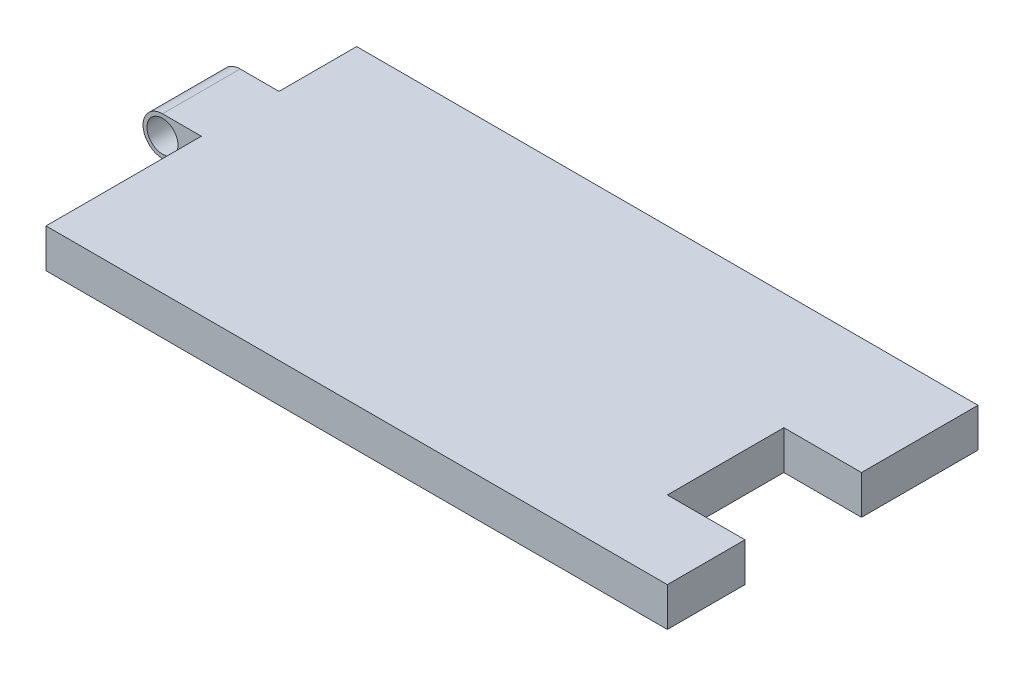
ISO-10303-21;
HEADER;
FILE_DESCRIPTION(('STEP AP214'),'2;1');
FILE_NAME('part.step','',(''),(''),'','','');
FILE_SCHEMA(('AUTOMOTIVE_DESIGN { 1 0 10303 214 1 1 1 1 }'));
ENDSEC;
DATA;
#1=APPLICATION_CONTEXT('core data for automotive mechanical design processes');
#2=APPLICATION_PROTOCOL_DEFINITION('international standard','automotive_design',2000,#1);
#3=PRODUCT_CONTEXT('',#1,'mechanical');
#4=PRODUCT('Part','Part','',(#3));
#5=PRODUCT_RELATED_PRODUCT_CATEGORY('part','',(#4));
#6=PRODUCT_DEFINITION_FORMATION('','',#4);
#7=PRODUCT_DEFINITION_CONTEXT('part definition',#1,'design');
#8=PRODUCT_DEFINITION('design','',#6,#7);
#9=PRODUCT_DEFINITION_SHAPE('','',#8);
#10=(LENGTH_UNIT() NAMED_UNIT(*) SI_UNIT(.MILLI.,.METRE.));
#11=(NAMED_UNIT(*) PLANE_ANGLE_UNIT() SI_UNIT($,.RADIAN.));
#12=(NAMED_UNIT(*) SI_UNIT($,.STERADIAN.) SOLID_ANGLE_UNIT());
#13=UNCERTAINTY_MEASURE_WITH_UNIT(LENGTH_MEASURE(1.E-05),#10,'distance_accuracy_value','');
#14=(GEOMETRIC_REPRESENTATION_CONTEXT(3) GLOBAL_UNCERTAINTY_ASSIGNED_CONTEXT((#13)) GLOBAL_UNIT_ASSIGNED_CONTEXT((#10,
#11,#12)) REPRESENTATION_CONTEXT('',''));
#15=CARTESIAN_POINT('',(0.,0.,0.));
#16=DIRECTION('',(0.,0.,1.));
#17=DIRECTION('',(1.,0.,0.));
#18=AXIS2_PLACEMENT_3D('',#15,#16,#17);
#19=CARTESIAN_POINT('',(0.,-2.5,-5.));
#20=DIRECTION('',(0.,-1.,0.));
#21=DIRECTION('',(0.,0.,-1.));
#22=AXIS2_PLACEMENT_3D('',#19,#20,#21);
#23=PLANE('',#22);
#24=DIRECTION('',(0.,0.,1.));
#25=VECTOR('',#24,1.);
#26=CARTESIAN_POINT('',(-5.,-2.49999999999998,0.));
#27=LINE('',#26,#25);
#28=CARTESIAN_POINT('',(-5.,-2.49999999999998,0.));
#29=VERTEX_POINT('',#28);
#30=CARTESIAN_POINT('',(-5.,-2.49999999999998,15.));
#31=VERTEX_POINT('',#30);
#32=EDGE_CURVE('E183',#29,#31,#27,.T.);
#33=ORIENTED_EDGE('',*,*,#32,.T.);
#34=DIRECTION('',(1.,0.,0.));
#35=VECTOR('',#34,1.);
#36=CARTESIAN_POINT('',(-75.,-2.5,15.));
#37=LINE('',#36,#35);
#38=CARTESIAN_POINT('',(5.,-2.5,15.));
#39=VERTEX_POINT('',#38);
#40=EDGE_CURVE('E165',#31,#39,#37,.T.);
#41=ORIENTED_EDGE('',*,*,#40,.T.);
#42=DIRECTION('',(0.,0.,-1.));
#43=VECTOR('',#42,1.);
#44=CARTESIAN_POINT('',(5.,-2.5,25.));
#45=LINE('',#44,#43);
#46=CARTESIAN_POINT('',(5.,-2.5,25.));
#47=VERTEX_POINT('',#46);
#48=EDGE_CURVE('E140',#47,#39,#45,.T.);
#49=ORIENTED_EDGE('',*,*,#48,.F.);
#50=DIRECTION('',(1.,0.,0.));
#51=VECTOR('',#50,1.);
#52=CARTESIAN_POINT('',(-75.,-2.5,25.));
#53=LINE('',#52,#51);
#54=CARTESIAN_POINT('',(-75.,-2.5,25.));
#55=VERTEX_POINT('',#54);
#56=EDGE_CURVE('E136',#55,#47,#53,.T.);
#57=ORIENTED_EDGE('',*,*,#56,.F.);
#58=DIRECTION('',(0.,0.,-1.));
#59=VECTOR('',#58,1.);
#60=CARTESIAN_POINT('',(-75.,-2.5,15.));
#61=LINE('',#60,#59);
#62=CARTESIAN_POINT('',(-75.,-2.5,5.));
#63=VERTEX_POINT('',#62);
#64=EDGE_CURVE('E125',#55,#63,#61,.T.);
#65=ORIENTED_EDGE('',*,*,#64,.T.);
#66=DIRECTION('',(1.,0.,0.));
#67=VECTOR('',#66,1.);
#68=CARTESIAN_POINT('',(0.,-2.5,5.));
#69=LINE('',#68,#67);
#70=CARTESIAN_POINT('',(-80.,-2.5,5.));
#71=VERTEX_POINT('',#70);
#72=EDGE_CURVE('E230',#71,#63,#69,.T.);
#73=ORIENTED_EDGE('',*,*,#72,.F.);
#74=DIRECTION('',(0.,0.,1.));
#75=VECTOR('',#74,1.);
#76=CARTESIAN_POINT('',(-80.,-2.5,-5.));
#77=LINE('',#76,#75);
#78=CARTESIAN_POINT('',(-80.,-2.5,-5.));
#79=VERTEX_POINT('',#78);
#80=EDGE_CURVE('E42',#79,#71,#77,.T.);
#81=ORIENTED_EDGE('',*,*,#80,.F.);
#82=DIRECTION('',(1.,0.,0.));
#83=VECTOR('',#82,1.);
#84=CARTESIAN_POINT('',(0.,-2.5,-5.));
#85=LINE('',#84,#83);
#86=CARTESIAN_POINT('',(-75.,-2.5,-5.));
#87=VERTEX_POINT('',#86);
#88=EDGE_CURVE('E222',#79,#87,#85,.T.);
#89=ORIENTED_EDGE('',*,*,#88,.T.);
#90=DIRECTION('',(0.,0.,1.));
#91=VECTOR('',#90,1.);
#92=CARTESIAN_POINT('',(-75.,-2.49999999999999,-15.));
#93=LINE('',#92,#91);
#94=CARTESIAN_POINT('',(-75.,-2.49999999999999,-15.));
#95=VERTEX_POINT('',#94);
#96=EDGE_CURVE('E248',#95,#87,#93,.T.);
#97=ORIENTED_EDGE('',*,*,#96,.F.);
#98=DIRECTION('',(-1.,0.,0.));
#99=VECTOR('',#98,1.);
#100=CARTESIAN_POINT('',(0.,-2.5,-15.));
#101=LINE('',#100,#99);
#102=CARTESIAN_POINT('',(5.,-2.49999999999998,-15.));
#103=VERTEX_POINT('',#102);
#104=EDGE_CURVE('E280',#103,#95,#101,.T.);
#105=ORIENTED_EDGE('',*,*,#104,.F.);
#106=DIRECTION('',(0.,0.,-1.));
#107=VECTOR('',#106,1.);
#108=CARTESIAN_POINT('',(5.,-2.49999999999998,-15.));
#109=LINE('',#108,#107);
#110=CARTESIAN_POINT('',(5.,-2.49999999999998,0.));
#111=VERTEX_POINT('',#110);
#112=EDGE_CURVE('E267',#111,#103,#109,.T.);
#113=ORIENTED_EDGE('',*,*,#112,.F.);
#114=DIRECTION('',(1.,0.,0.));
#115=VECTOR('',#114,1.);
#116=CARTESIAN_POINT('',(5.,-2.49999999999998,0.));
#117=LINE('',#116,#115);
#118=EDGE_CURVE('E266',#29,#111,#117,.T.);
#119=ORIENTED_EDGE('',*,*,#118,.F.);
#120=EDGE_LOOP('',(#33,#41,#49,#57,#65,#73,#81,#89,#97,#105,#113,#119));
#121=FACE_BOUND('',#120,.T.);
#122=CARTESIAN_POINT('',(-10.,-2.5,-10.));
#123=DIRECTION('',(0.,-1.,0.));
#124=DIRECTION('',(0.,0.,-1.));
#125=AXIS2_PLACEMENT_3D('',#122,#123,#124);
#126=CIRCLE('',#125,2.);
#127=CARTESIAN_POINT('',(-10.,-2.5,-12.));
#128=VERTEX_POINT('',#127);
#129=EDGE_CURVE('E155',#128,#128,#126,.T.);
#130=ORIENTED_EDGE('',*,*,#129,.F.);
#131=EDGE_LOOP('',(#130));
#132=FACE_BOUND('',#131,.T.);
#133=ADVANCED_FACE('F33',(#121,#132),#23,.T.);
#134=CARTESIAN_POINT('',(-80.,0.,-5.));
#135=DIRECTION('',(0.,0.,1.));
#136=DIRECTION('',(1.,0.,0.));
#137=AXIS2_PLACEMENT_3D('',#134,#135,#136);
#138=PLANE('',#137);
#139=CARTESIAN_POINT('',(-80.,0.,-5.));
#140=DIRECTION('',(0.,0.,1.));
#141=DIRECTION('',(1.,0.,0.));
#142=AXIS2_PLACEMENT_3D('',#139,#140,#141);
#143=CIRCLE('',#142,2.);
#144=CARTESIAN_POINT('',(-78.,0.,-5.));
#145=VERTEX_POINT('',#144);
#146=EDGE_CURVE('E239',#145,#145,#143,.T.);
#147=ORIENTED_EDGE('',*,*,#146,.T.);
#148=EDGE_LOOP('',(#147));
#149=FACE_BOUND('',#148,.T.);
#150=DIRECTION('',(0.,1.,0.));
#151=VECTOR('',#150,1.);
#152=CARTESIAN_POINT('',(-75.,-2.49999999999999,-5.));
#153=LINE('',#152,#151);
#154=CARTESIAN_POINT('',(-75.,2.50000000000002,-5.));
#155=VERTEX_POINT('',#154);
#156=EDGE_CURVE('E50',#87,#155,#153,.T.);
#157=ORIENTED_EDGE('',*,*,#156,.F.);
#158=ORIENTED_EDGE('',*,*,#88,.F.);
#159=CARTESIAN_POINT('',(-80.,0.,-5.));
#160=DIRECTION('',(0.,0.,1.));
#161=DIRECTION('',(1.,0.,0.));
#162=AXIS2_PLACEMENT_3D('',#159,#160,#161);
#163=CIRCLE('',#162,2.50000000000001);
#164=CARTESIAN_POINT('',(-80.,2.50000000000002,-5.));
#165=VERTEX_POINT('',#164);
#166=EDGE_CURVE('E241',#165,#79,#163,.T.);
#167=ORIENTED_EDGE('',*,*,#166,.F.);
#168=DIRECTION('',(-1.,0.,0.));
#169=VECTOR('',#168,1.);
#170=CARTESIAN_POINT('',(-80.,2.50000000000002,-5.));
#171=LINE('',#170,#169);
#172=EDGE_CURVE('E219',#155,#165,#171,.T.);
#173=ORIENTED_EDGE('',*,*,#172,.F.);
#174=EDGE_LOOP('',(#157,#158,#167,#173));
#175=FACE_BOUND('',#174,.T.);
#176=ADVANCED_FACE('F291',(#149,#175),#138,.F.);
#177=CARTESIAN_POINT('',(-80.,0.,-5.));
#178=DIRECTION('',(0.,0.,1.));
#179=DIRECTION('',(1.,0.,0.));
#180=AXIS2_PLACEMENT_3D('',#177,#178,#179);
#181=CYLINDRICAL_SURFACE('',#180,2.50000000000001);
#182=ORIENTED_EDGE('',*,*,#80,.T.);
#183=CARTESIAN_POINT('',(-80.,0.,5.));
#184=DIRECTION('',(0.,0.,1.));
#185=DIRECTION('',(1.,0.,0.));
#186=AXIS2_PLACEMENT_3D('',#183,#184,#185);
#187=CIRCLE('',#186,2.50000000000001);
#188=CARTESIAN_POINT('',(-80.,2.50000000000002,5.));
#189=VERTEX_POINT('',#188);
#190=EDGE_CURVE('E212',#189,#71,#187,.T.);
#191=ORIENTED_EDGE('',*,*,#190,.F.);
#192=DIRECTION('',(0.,0.,1.));
#193=VECTOR('',#192,1.);
#194=CARTESIAN_POINT('',(-80.,2.50000000000002,-5.));
#195=LINE('',#194,#193);
#196=EDGE_CURVE('E11',#165,#189,#195,.T.);
#197=ORIENTED_EDGE('',*,*,#196,.F.);
#198=ORIENTED_EDGE('',*,*,#166,.T.);
#199=EDGE_LOOP('',(#182,#191,#197,#198));
#200=FACE_BOUND('',#199,.T.);
#201=ADVANCED_FACE('F35',(#200),#181,.T.);
#202=CARTESIAN_POINT('',(-80.,2.50000000000002,-5.));
#203=DIRECTION('',(0.,1.,0.));
#204=DIRECTION('',(0.,0.,1.));
#205=AXIS2_PLACEMENT_3D('',#202,#203,#204);
#206=PLANE('',#205);
#207=DIRECTION('',(0.,0.,1.));
#208=VECTOR('',#207,1.);
#209=CARTESIAN_POINT('',(-5.,2.50000000000002,0.));
#210=LINE('',#209,#208);
#211=CARTESIAN_POINT('',(-5.,2.50000000000002,0.));
#212=VERTEX_POINT('',#211);
#213=CARTESIAN_POINT('',(-5.,2.50000000000002,15.));
#214=VERTEX_POINT('',#213);
#215=EDGE_CURVE('E181',#212,#214,#210,.T.);
#216=ORIENTED_EDGE('',*,*,#215,.F.);
#217=DIRECTION('',(1.,0.,0.));
#218=VECTOR('',#217,1.);
#219=CARTESIAN_POINT('',(5.,2.50000000000002,0.));
#220=LINE('',#219,#218);
#221=CARTESIAN_POINT('',(5.,2.50000000000002,0.));
#222=VERTEX_POINT('',#221);
#223=EDGE_CURVE('E178',#212,#222,#220,.T.);
#224=ORIENTED_EDGE('',*,*,#223,.T.);
#225=DIRECTION('',(0.,0.,-1.));
#226=VECTOR('',#225,1.);
#227=CARTESIAN_POINT('',(5.,2.50000000000002,-15.));
#228=LINE('',#227,#226);
#229=CARTESIAN_POINT('',(5.,2.50000000000002,-15.));
#230=VERTEX_POINT('',#229);
#231=EDGE_CURVE('E264',#222,#230,#228,.T.);
#232=ORIENTED_EDGE('',*,*,#231,.T.);
#233=DIRECTION('',(1.,0.,0.));
#234=VECTOR('',#233,1.);
#235=CARTESIAN_POINT('',(-75.,2.50000000000002,-15.));
#236=LINE('',#235,#234);
#237=CARTESIAN_POINT('',(-75.,2.50000000000002,-15.));
#238=VERTEX_POINT('',#237);
#239=EDGE_CURVE('E278',#238,#230,#236,.T.);
#240=ORIENTED_EDGE('',*,*,#239,.F.);
#241=DIRECTION('',(0.,0.,1.));
#242=VECTOR('',#241,1.);
#243=CARTESIAN_POINT('',(-75.,2.50000000000002,-15.));
#244=LINE('',#243,#242);
#245=EDGE_CURVE('E255',#238,#155,#244,.T.);
#246=ORIENTED_EDGE('',*,*,#245,.T.);
#247=ORIENTED_EDGE('',*,*,#172,.T.);
#248=ORIENTED_EDGE('',*,*,#196,.T.);
#249=DIRECTION('',(-1.,0.,0.));
#250=VECTOR('',#249,1.);
#251=CARTESIAN_POINT('',(-80.,2.50000000000002,5.));
#252=LINE('',#251,#250);
#253=CARTESIAN_POINT('',(-75.,2.50000000000002,5.));
#254=VERTEX_POINT('',#253);
#255=EDGE_CURVE('E208',#254,#189,#252,.T.);
#256=ORIENTED_EDGE('',*,*,#255,.F.);
#257=DIRECTION('',(0.,0.,-1.));
#258=VECTOR('',#257,1.);
#259=CARTESIAN_POINT('',(-75.,2.50000000000002,15.));
#260=LINE('',#259,#258);
#261=CARTESIAN_POINT('',(-75.,2.50000000000002,25.));
#262=VERTEX_POINT('',#261);
#263=EDGE_CURVE('E133',#262,#254,#260,.T.);
#264=ORIENTED_EDGE('',*,*,#263,.F.);
#265=DIRECTION('',(-1.,0.,0.));
#266=VECTOR('',#265,1.);
#267=CARTESIAN_POINT('',(-75.,2.50000000000002,25.));
#268=LINE('',#267,#266);
#269=CARTESIAN_POINT('',(5.,2.50000000000002,25.));
#270=VERTEX_POINT('',#269);
#271=EDGE_CURVE('E148',#270,#262,#268,.T.);
#272=ORIENTED_EDGE('',*,*,#271,.F.);
#273=DIRECTION('',(0.,0.,-1.));
#274=VECTOR('',#273,1.);
#275=CARTESIAN_POINT('',(5.,2.50000000000002,25.));
#276=LINE('',#275,#274);
#277=CARTESIAN_POINT('',(5.,2.50000000000002,15.));
#278=VERTEX_POINT('',#277);
#279=EDGE_CURVE('E160',#270,#278,#276,.T.);
#280=ORIENTED_EDGE('',*,*,#279,.T.);
#281=DIRECTION('',(-1.,0.,0.));
#282=VECTOR('',#281,1.);
#283=CARTESIAN_POINT('',(-75.,2.50000000000002,15.));
#284=LINE('',#283,#282);
#285=EDGE_CURVE('E149',#278,#214,#284,.T.);
#286=ORIENTED_EDGE('',*,*,#285,.T.);
#287=EDGE_LOOP('',(#216,#224,#232,#240,#246,#247,#248,#256,#264,#272,#280,#286));
#288=FACE_BOUND('',#287,.T.);
#289=ADVANCED_FACE('F196',(#288),#206,.T.);
#290=CARTESIAN_POINT('',(-80.,0.,-5.));
#291=DIRECTION('',(0.,0.,1.));
#292=DIRECTION('',(1.,0.,0.));
#293=AXIS2_PLACEMENT_3D('',#290,#291,#292);
#294=CYLINDRICAL_SURFACE('',#293,2.);
#295=ORIENTED_EDGE('',*,*,#146,.F.);
#296=EDGE_LOOP('',(#295));
#297=FACE_BOUND('',#296,.T.);
#298=CARTESIAN_POINT('',(-80.,0.,5.));
#299=DIRECTION('',(0.,0.,1.));
#300=DIRECTION('',(1.,0.,0.));
#301=AXIS2_PLACEMENT_3D('',#298,#299,#300);
#302=CIRCLE('',#301,2.);
#303=CARTESIAN_POINT('',(-78.,0.,5.));
#304=VERTEX_POINT('',#303);
#305=EDGE_CURVE('E209',#304,#304,#302,.T.);
#306=ORIENTED_EDGE('',*,*,#305,.T.);
#307=EDGE_LOOP('',(#306));
#308=FACE_BOUND('',#307,.T.);
#309=ADVANCED_FACE('F301',(#297,#308),#294,.F.);
#310=CARTESIAN_POINT('',(-80.,0.,5.));
#311=DIRECTION('',(0.,0.,1.));
#312=DIRECTION('',(1.,0.,0.));
#313=AXIS2_PLACEMENT_3D('',#310,#311,#312);
#314=PLANE('',#313);
#315=DIRECTION('',(0.,-1.,0.));
#316=VECTOR('',#315,1.);
#317=CARTESIAN_POINT('',(-75.,2.50000000000002,5.));
#318=LINE('',#317,#316);
#319=EDGE_CURVE('E58',#254,#63,#318,.T.);
#320=ORIENTED_EDGE('',*,*,#319,.F.);
#321=ORIENTED_EDGE('',*,*,#255,.T.);
#322=ORIENTED_EDGE('',*,*,#190,.T.);
#323=ORIENTED_EDGE('',*,*,#72,.T.);
#324=EDGE_LOOP('',(#320,#321,#322,#323));
#325=FACE_BOUND('',#324,.T.);
#326=ORIENTED_EDGE('',*,*,#305,.F.);
#327=EDGE_LOOP('',(#326));
#328=FACE_BOUND('',#327,.T.);
#329=ADVANCED_FACE('F307',(#325,#328),#314,.T.);
#330=CARTESIAN_POINT('',(-75.,2.50000000000002,15.));
#331=DIRECTION('',(1.,0.,0.));
#332=DIRECTION('',(0.,0.,-1.));
#333=AXIS2_PLACEMENT_3D('',#330,#331,#332);
#334=PLANE('',#333);
#335=ORIENTED_EDGE('',*,*,#319,.T.);
#336=ORIENTED_EDGE('',*,*,#64,.F.);
#337=DIRECTION('',(0.,-1.,0.));
#338=VECTOR('',#337,1.);
#339=CARTESIAN_POINT('',(-75.,-2.5,25.));
#340=LINE('',#339,#338);
#341=EDGE_CURVE('E130',#262,#55,#340,.T.);
#342=ORIENTED_EDGE('',*,*,#341,.F.);
#343=ORIENTED_EDGE('',*,*,#263,.T.);
#344=EDGE_LOOP('',(#335,#336,#342,#343));
#345=FACE_BOUND('',#344,.T.);
#346=ADVANCED_FACE('F127',(#345),#334,.F.);
#347=CARTESIAN_POINT('',(-75.,-2.49999999999999,-15.));
#348=DIRECTION('',(1.,0.,0.));
#349=DIRECTION('',(0.,0.,-1.));
#350=AXIS2_PLACEMENT_3D('',#347,#348,#349);
#351=PLANE('',#350);
#352=ORIENTED_EDGE('',*,*,#156,.T.);
#353=ORIENTED_EDGE('',*,*,#245,.F.);
#354=DIRECTION('',(0.,1.,0.));
#355=VECTOR('',#354,1.);
#356=CARTESIAN_POINT('',(-75.,-2.49999999999999,-15.));
#357=LINE('',#356,#355);
#358=EDGE_CURVE('E254',#95,#238,#357,.T.);
#359=ORIENTED_EDGE('',*,*,#358,.F.);
#360=ORIENTED_EDGE('',*,*,#96,.T.);
#361=EDGE_LOOP('',(#352,#353,#359,#360));
#362=FACE_BOUND('',#361,.T.);
#363=ADVANCED_FACE('F251',(#362),#351,.F.);
#364=CARTESIAN_POINT('',(0.,0.,-15.));
#365=DIRECTION('',(0.,0.,-1.));
#366=DIRECTION('',(-1.,0.,0.));
#367=AXIS2_PLACEMENT_3D('',#364,#365,#366);
#368=PLANE('',#367);
#369=ORIENTED_EDGE('',*,*,#239,.T.);
#370=DIRECTION('',(0.,1.,0.));
#371=VECTOR('',#370,1.);
#372=CARTESIAN_POINT('',(5.,-2.49999999999998,-15.));
#373=LINE('',#372,#371);
#374=EDGE_CURVE('E274',#103,#230,#373,.T.);
#375=ORIENTED_EDGE('',*,*,#374,.F.);
#376=ORIENTED_EDGE('',*,*,#104,.T.);
#377=ORIENTED_EDGE('',*,*,#358,.T.);
#378=EDGE_LOOP('',(#369,#375,#376,#377));
#379=FACE_BOUND('',#378,.T.);
#380=ADVANCED_FACE('F287',(#379),#368,.T.);
#381=CARTESIAN_POINT('',(5.,-2.49999999999998,-15.));
#382=DIRECTION('',(1.,0.,0.));
#383=DIRECTION('',(0.,0.,-1.));
#384=AXIS2_PLACEMENT_3D('',#381,#382,#383);
#385=PLANE('',#384);
#386=ORIENTED_EDGE('',*,*,#231,.F.);
#387=DIRECTION('',(0.,1.,0.));
#388=VECTOR('',#387,1.);
#389=CARTESIAN_POINT('',(5.,-2.49999999999998,0.));
#390=LINE('',#389,#388);
#391=EDGE_CURVE('E269',#111,#222,#390,.T.);
#392=ORIENTED_EDGE('',*,*,#391,.F.);
#393=ORIENTED_EDGE('',*,*,#112,.T.);
#394=ORIENTED_EDGE('',*,*,#374,.T.);
#395=EDGE_LOOP('',(#386,#392,#393,#394));
#396=FACE_BOUND('',#395,.T.);
#397=ADVANCED_FACE('F325',(#396),#385,.T.);
#398=CARTESIAN_POINT('',(5.,-2.49999999999998,0.));
#399=DIRECTION('',(0.,0.,1.));
#400=DIRECTION('',(1.,0.,0.));
#401=AXIS2_PLACEMENT_3D('',#398,#399,#400);
#402=PLANE('',#401);
#403=ORIENTED_EDGE('',*,*,#223,.F.);
#404=DIRECTION('',(0.,1.,0.));
#405=VECTOR('',#404,1.);
#406=CARTESIAN_POINT('',(-5.,-2.49999999999998,0.));
#407=LINE('',#406,#405);
#408=EDGE_CURVE('E171',#29,#212,#407,.T.);
#409=ORIENTED_EDGE('',*,*,#408,.F.);
#410=ORIENTED_EDGE('',*,*,#118,.T.);
#411=ORIENTED_EDGE('',*,*,#391,.T.);
#412=EDGE_LOOP('',(#403,#409,#410,#411));
#413=FACE_BOUND('',#412,.T.);
#414=ADVANCED_FACE('F326',(#413),#402,.T.);
#415=CARTESIAN_POINT('',(-5.,-2.49999999999998,0.));
#416=DIRECTION('',(-1.,0.,0.));
#417=DIRECTION('',(0.,0.,1.));
#418=AXIS2_PLACEMENT_3D('',#415,#416,#417);
#419=PLANE('',#418);
#420=ORIENTED_EDGE('',*,*,#215,.T.);
#421=DIRECTION('',(0.,1.,0.));
#422=VECTOR('',#421,1.);
#423=CARTESIAN_POINT('',(-5.,-2.49999999999998,15.));
#424=LINE('',#423,#422);
#425=EDGE_CURVE('E174',#31,#214,#424,.T.);
#426=ORIENTED_EDGE('',*,*,#425,.F.);
#427=ORIENTED_EDGE('',*,*,#32,.F.);
#428=ORIENTED_EDGE('',*,*,#408,.T.);
#429=EDGE_LOOP('',(#420,#426,#427,#428));
#430=FACE_BOUND('',#429,.T.);
#431=ADVANCED_FACE('F191',(#430),#419,.F.);
#432=CARTESIAN_POINT('',(5.,-2.5,25.));
#433=DIRECTION('',(-1.,0.,0.));
#434=DIRECTION('',(0.,0.,1.));
#435=AXIS2_PLACEMENT_3D('',#432,#433,#434);
#436=PLANE('',#435);
#437=DIRECTION('',(0.,1.,0.));
#438=VECTOR('',#437,1.);
#439=CARTESIAN_POINT('',(5.,-2.5,15.));
#440=LINE('',#439,#438);
#441=EDGE_CURVE('E152',#39,#278,#440,.T.);
#442=ORIENTED_EDGE('',*,*,#441,.T.);
#443=ORIENTED_EDGE('',*,*,#279,.F.);
#444=DIRECTION('',(0.,1.,0.));
#445=VECTOR('',#444,1.);
#446=CARTESIAN_POINT('',(5.,-2.5,25.));
#447=LINE('',#446,#445);
#448=EDGE_CURVE('E143',#47,#270,#447,.T.);
#449=ORIENTED_EDGE('',*,*,#448,.F.);
#450=ORIENTED_EDGE('',*,*,#48,.T.);
#451=EDGE_LOOP('',(#442,#443,#449,#450));
#452=FACE_BOUND('',#451,.T.);
#453=ADVANCED_FACE('F205',(#452),#436,.F.);
#454=CARTESIAN_POINT('',(0.,0.,25.));
#455=DIRECTION('',(0.,0.,-1.));
#456=DIRECTION('',(-1.,0.,0.));
#457=AXIS2_PLACEMENT_3D('',#454,#455,#456);
#458=PLANE('',#457);
#459=ORIENTED_EDGE('',*,*,#341,.T.);
#460=ORIENTED_EDGE('',*,*,#56,.T.);
#461=ORIENTED_EDGE('',*,*,#448,.T.);
#462=ORIENTED_EDGE('',*,*,#271,.T.);
#463=EDGE_LOOP('',(#459,#460,#461,#462));
#464=FACE_BOUND('',#463,.T.);
#465=ADVANCED_FACE('F146',(#464),#458,.F.);
#466=CARTESIAN_POINT('',(0.,0.,15.));
#467=DIRECTION('',(0.,0.,-1.));
#468=DIRECTION('',(-1.,0.,0.));
#469=AXIS2_PLACEMENT_3D('',#466,#467,#468);
#470=PLANE('',#469);
#471=ORIENTED_EDGE('',*,*,#40,.F.);
#472=ORIENTED_EDGE('',*,*,#425,.T.);
#473=ORIENTED_EDGE('',*,*,#285,.F.);
#474=ORIENTED_EDGE('',*,*,#441,.F.);
#475=EDGE_LOOP('',(#471,#472,#473,#474));
#476=FACE_BOUND('',#475,.T.);
#477=ADVANCED_FACE('F203',(#476),#470,.T.);
#478=CARTESIAN_POINT('',(-10.,-7.5,-10.));
#479=DIRECTION('',(0.,1.,0.));
#480=DIRECTION('',(0.,0.,1.));
#481=AXIS2_PLACEMENT_3D('',#478,#479,#480);
#482=CYLINDRICAL_SURFACE('',#481,2.);
#483=CARTESIAN_POINT('',(-10.,-7.5,-10.));
#484=DIRECTION('',(0.,-1.,0.));
#485=DIRECTION('',(0.,0.,-1.));
#486=AXIS2_PLACEMENT_3D('',#483,#484,#485);
#487=CIRCLE('',#486,2.);
#488=CARTESIAN_POINT('',(-10.,-7.5,-12.));
#489=VERTEX_POINT('',#488);
#490=EDGE_CURVE('E167',#489,#489,#487,.T.);
#491=ORIENTED_EDGE('',*,*,#490,.F.);
#492=EDGE_LOOP('',(#491));
#493=FACE_BOUND('',#492,.T.);
#494=ORIENTED_EDGE('',*,*,#129,.T.);
#495=EDGE_LOOP('',(#494));
#496=FACE_BOUND('',#495,.T.);
#497=ADVANCED_FACE('F338',(#493,#496),#482,.T.);
#498=CARTESIAN_POINT('',(-10.,-7.5,-10.));
#499=DIRECTION('',(0.,-1.,0.));
#500=DIRECTION('',(0.,0.,-1.));
#501=AXIS2_PLACEMENT_3D('',#498,#499,#500);
#502=PLANE('',#501);
#503=ORIENTED_EDGE('',*,*,#490,.T.);
#504=EDGE_LOOP('',(#503));
#505=FACE_BOUND('',#504,.T.);
#506=ADVANCED_FACE('F343',(#505),#502,.T.);
#507=CLOSED_SHELL('',(#133,#176,#201,#289,#309,#329,#346,#363,#380,#397,#414,#431,#453,#465,
#477,#497,#506));
#508=MANIFOLD_SOLID_BREP('B2',#507);
#509=ADVANCED_BREP_SHAPE_REPRESENTATION('',(#18,#508),#14);
#510=SHAPE_DEFINITION_REPRESENTATION(#9,#509);
ENDSEC;
END-ISO-10303-21;
